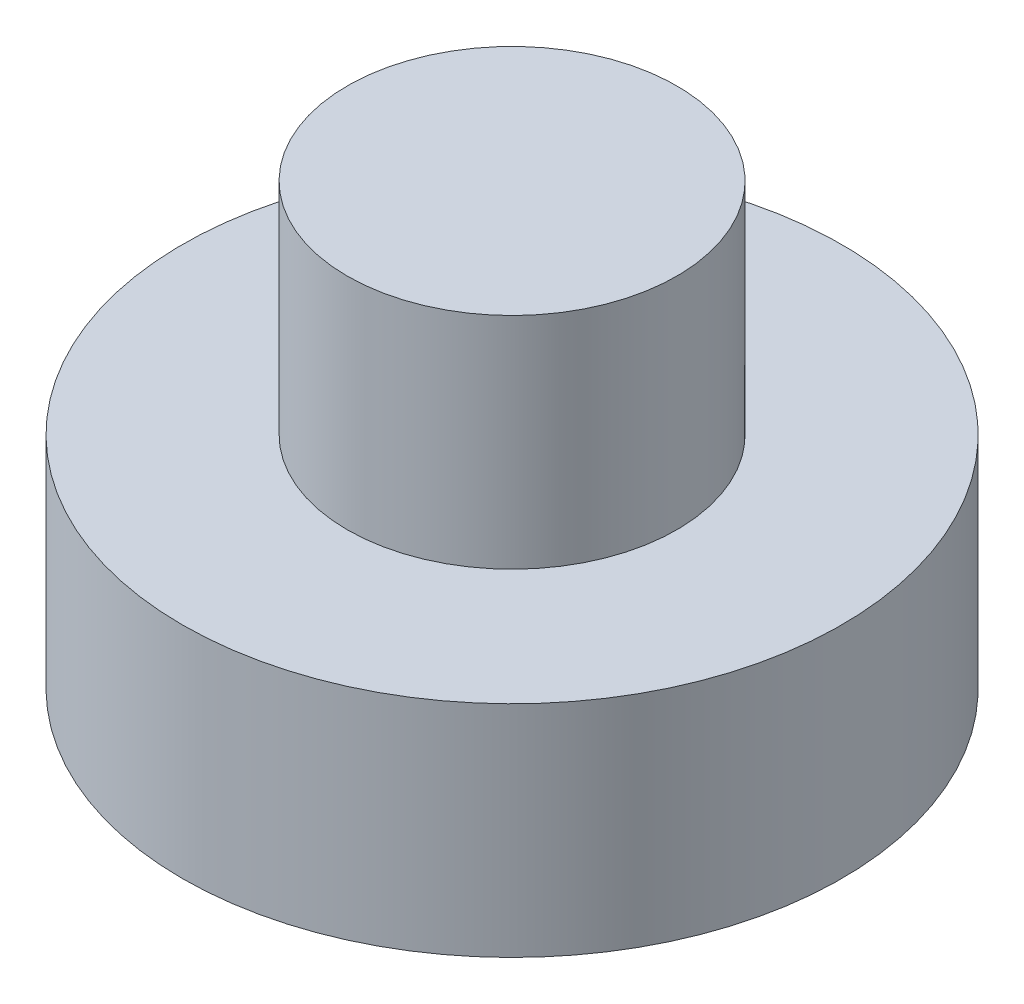
ISO-10303-21;
HEADER;
FILE_DESCRIPTION(('STEP AP214'),'2;1');
FILE_NAME('part.step','',(''),(''),'','','');
FILE_SCHEMA(('AUTOMOTIVE_DESIGN { 1 0 10303 214 1 1 1 1 }'));
ENDSEC;
DATA;
#1=APPLICATION_CONTEXT('core data for automotive mechanical design processes');
#2=APPLICATION_PROTOCOL_DEFINITION('international standard','automotive_design',2000,#1);
#3=PRODUCT_CONTEXT('',#1,'mechanical');
#4=PRODUCT('Part','Part','',(#3));
#5=PRODUCT_RELATED_PRODUCT_CATEGORY('part','',(#4));
#6=PRODUCT_DEFINITION_FORMATION('','',#4);
#7=PRODUCT_DEFINITION_CONTEXT('part definition',#1,'design');
#8=PRODUCT_DEFINITION('design','',#6,#7);
#9=PRODUCT_DEFINITION_SHAPE('','',#8);
#10=(LENGTH_UNIT() NAMED_UNIT(*) SI_UNIT(.MILLI.,.METRE.));
#11=(NAMED_UNIT(*) PLANE_ANGLE_UNIT() SI_UNIT($,.RADIAN.));
#12=(NAMED_UNIT(*) SI_UNIT($,.STERADIAN.) SOLID_ANGLE_UNIT());
#13=UNCERTAINTY_MEASURE_WITH_UNIT(LENGTH_MEASURE(1.E-05),#10,'distance_accuracy_value','');
#14=(GEOMETRIC_REPRESENTATION_CONTEXT(3) GLOBAL_UNCERTAINTY_ASSIGNED_CONTEXT((#13)) GLOBAL_UNIT_ASSIGNED_CONTEXT((#10,
#11,#12)) REPRESENTATION_CONTEXT('',''));
#15=CARTESIAN_POINT('',(0.,0.,0.));
#16=DIRECTION('',(0.,0.,1.));
#17=DIRECTION('',(1.,0.,0.));
#18=AXIS2_PLACEMENT_3D('',#15,#16,#17);
#19=CARTESIAN_POINT('',(0.,20.,0.));
#20=DIRECTION('',(0.,-1.,0.));
#21=DIRECTION('',(0.,0.,-1.));
#22=AXIS2_PLACEMENT_3D('',#19,#20,#21);
#23=CYLINDRICAL_SURFACE('',#22,30.);
#24=CARTESIAN_POINT('',(0.,20.,0.));
#25=DIRECTION('',(0.,1.,0.));
#26=DIRECTION('',(0.,0.,1.));
#27=AXIS2_PLACEMENT_3D('',#24,#25,#26);
#28=CIRCLE('',#27,30.);
#29=CARTESIAN_POINT('',(0.,20.,30.));
#30=VERTEX_POINT('',#29);
#31=EDGE_CURVE('E40',#30,#30,#28,.T.);
#32=ORIENTED_EDGE('',*,*,#31,.F.);
#33=EDGE_LOOP('',(#32));
#34=FACE_BOUND('',#33,.T.);
#35=CARTESIAN_POINT('',(0.,0.,0.));
#36=DIRECTION('',(0.,1.,0.));
#37=DIRECTION('',(0.,0.,1.));
#38=AXIS2_PLACEMENT_3D('',#35,#36,#37);
#39=CIRCLE('',#38,30.);
#40=CARTESIAN_POINT('',(0.,0.,30.));
#41=VERTEX_POINT('',#40);
#42=EDGE_CURVE('E36',#41,#41,#39,.T.);
#43=ORIENTED_EDGE('',*,*,#42,.T.);
#44=EDGE_LOOP('',(#43));
#45=FACE_BOUND('',#44,.T.);
#46=ADVANCED_FACE('F33',(#34,#45),#23,.T.);
#47=CARTESIAN_POINT('',(0.,20.,0.));
#48=DIRECTION('',(0.,1.,0.));
#49=DIRECTION('',(0.,0.,1.));
#50=AXIS2_PLACEMENT_3D('',#47,#48,#49);
#51=PLANE('',#50);
#52=CARTESIAN_POINT('',(0.,20.,0.));
#53=DIRECTION('',(0.,1.,0.));
#54=DIRECTION('',(0.,0.,1.));
#55=AXIS2_PLACEMENT_3D('',#52,#53,#54);
#56=CIRCLE('',#55,15.);
#57=CARTESIAN_POINT('',(0.,20.,15.));
#58=VERTEX_POINT('',#57);
#59=EDGE_CURVE('E10',#58,#58,#56,.T.);
#60=ORIENTED_EDGE('',*,*,#59,.F.);
#61=EDGE_LOOP('',(#60));
#62=FACE_BOUND('',#61,.T.);
#63=ORIENTED_EDGE('',*,*,#31,.T.);
#64=EDGE_LOOP('',(#63));
#65=FACE_BOUND('',#64,.T.);
#66=ADVANCED_FACE('F57',(#62,#65),#51,.T.);
#67=CARTESIAN_POINT('',(0.,0.,0.));
#68=DIRECTION('',(0.,1.,0.));
#69=DIRECTION('',(0.,0.,1.));
#70=AXIS2_PLACEMENT_3D('',#67,#68,#69);
#71=PLANE('',#70);
#72=ORIENTED_EDGE('',*,*,#42,.F.);
#73=EDGE_LOOP('',(#72));
#74=FACE_BOUND('',#73,.T.);
#75=ADVANCED_FACE('F54',(#74),#71,.F.);
#76=CARTESIAN_POINT('',(0.,40.,0.));
#77=DIRECTION('',(0.,-1.,0.));
#78=DIRECTION('',(0.,0.,-1.));
#79=AXIS2_PLACEMENT_3D('',#76,#77,#78);
#80=CYLINDRICAL_SURFACE('',#79,15.);
#81=CARTESIAN_POINT('',(0.,40.,0.));
#82=DIRECTION('',(0.,1.,0.));
#83=DIRECTION('',(0.,0.,1.));
#84=AXIS2_PLACEMENT_3D('',#81,#82,#83);
#85=CIRCLE('',#84,15.);
#86=CARTESIAN_POINT('',(0.,40.,15.));
#87=VERTEX_POINT('',#86);
#88=EDGE_CURVE('E46',#87,#87,#85,.T.);
#89=ORIENTED_EDGE('',*,*,#88,.F.);
#90=EDGE_LOOP('',(#89));
#91=FACE_BOUND('',#90,.T.);
#92=ORIENTED_EDGE('',*,*,#59,.T.);
#93=EDGE_LOOP('',(#92));
#94=FACE_BOUND('',#93,.T.);
#95=ADVANCED_FACE('F56',(#91,#94),#80,.T.);
#96=CARTESIAN_POINT('',(0.,40.,0.));
#97=DIRECTION('',(0.,1.,0.));
#98=DIRECTION('',(0.,0.,1.));
#99=AXIS2_PLACEMENT_3D('',#96,#97,#98);
#100=PLANE('',#99);
#101=ORIENTED_EDGE('',*,*,#88,.T.);
#102=EDGE_LOOP('',(#101));
#103=FACE_BOUND('',#102,.T.);
#104=ADVANCED_FACE('F62',(#103),#100,.T.);
#105=CLOSED_SHELL('',(#46,#66,#75,#95,#104));
#106=MANIFOLD_SOLID_BREP('B2',#105);
#107=ADVANCED_BREP_SHAPE_REPRESENTATION('',(#18,#106),#14);
#108=SHAPE_DEFINITION_REPRESENTATION(#9,#107);
ENDSEC;
END-ISO-10303-21;
